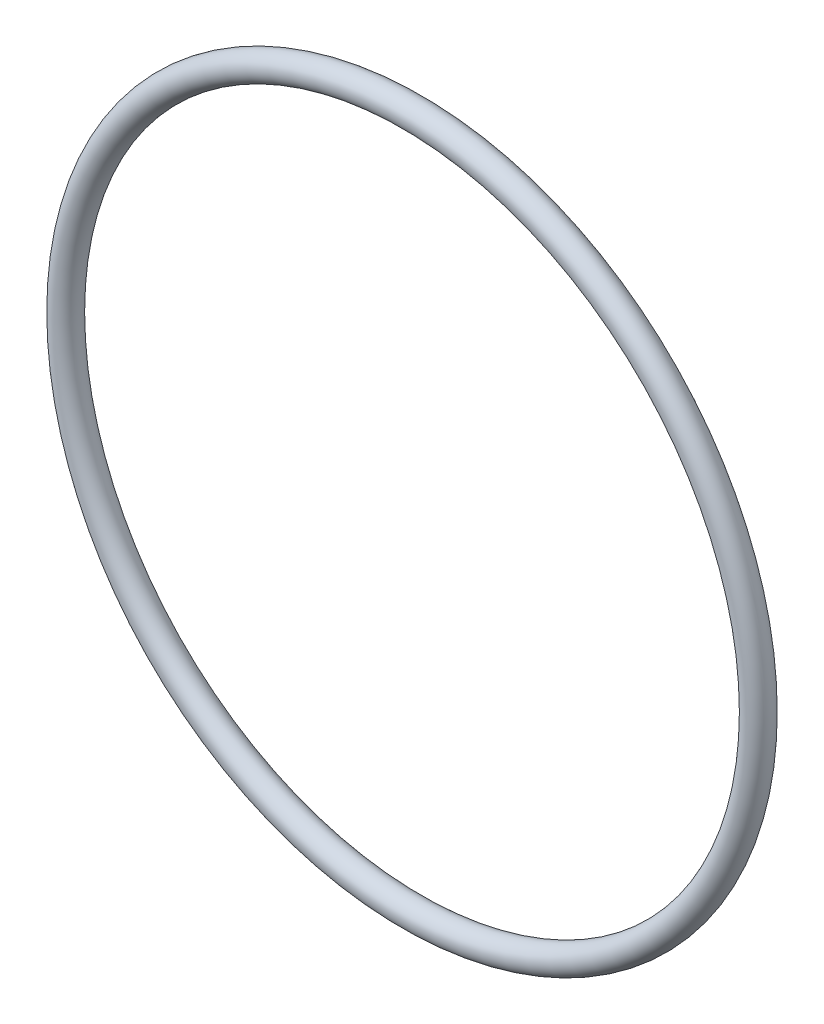
ISO-10303-21;
HEADER;
FILE_DESCRIPTION(('STEP AP214'),'2;1');
FILE_NAME('part.step','',(''),(''),'','','');
FILE_SCHEMA(('AUTOMOTIVE_DESIGN { 1 0 10303 214 1 1 1 1 }'));
ENDSEC;
DATA;
#1=APPLICATION_CONTEXT('core data for automotive mechanical design processes');
#2=APPLICATION_PROTOCOL_DEFINITION('international standard','automotive_design',2000,#1);
#3=PRODUCT_CONTEXT('',#1,'mechanical');
#4=PRODUCT('Part','Part','',(#3));
#5=PRODUCT_RELATED_PRODUCT_CATEGORY('part','',(#4));
#6=PRODUCT_DEFINITION_FORMATION('','',#4);
#7=PRODUCT_DEFINITION_CONTEXT('part definition',#1,'design');
#8=PRODUCT_DEFINITION('design','',#6,#7);
#9=PRODUCT_DEFINITION_SHAPE('','',#8);
#10=(LENGTH_UNIT() NAMED_UNIT(*) SI_UNIT(.MILLI.,.METRE.));
#11=(NAMED_UNIT(*) PLANE_ANGLE_UNIT() SI_UNIT($,.RADIAN.));
#12=(NAMED_UNIT(*) SI_UNIT($,.STERADIAN.) SOLID_ANGLE_UNIT());
#13=UNCERTAINTY_MEASURE_WITH_UNIT(LENGTH_MEASURE(1.E-05),#10,'distance_accuracy_value','');
#14=(GEOMETRIC_REPRESENTATION_CONTEXT(3) GLOBAL_UNCERTAINTY_ASSIGNED_CONTEXT((#13)) GLOBAL_UNIT_ASSIGNED_CONTEXT((#10,
#11,#12)) REPRESENTATION_CONTEXT('',''));
#15=CARTESIAN_POINT('',(0.,0.,0.));
#16=DIRECTION('',(0.,0.,1.));
#17=DIRECTION('',(1.,0.,0.));
#18=AXIS2_PLACEMENT_3D('',#15,#16,#17);
#19=CARTESIAN_POINT('',(0.,0.,0.));
#20=DIRECTION('',(0.,0.,1.));
#21=DIRECTION('',(1.,0.,0.));
#22=AXIS2_PLACEMENT_3D('',#19,#20,#21);
#23=TOROIDAL_SURFACE('',#22,22.9743,0.888999999999996);
#24=CARTESIAN_POINT('',(23.8633,0.,0.));
#25=VERTEX_POINT('',#24);
#26=VERTEX_LOOP('',#25);
#27=FACE_BOUND('',#26,.T.);
#28=ADVANCED_FACE('F32',(#27),#23,.T.);
#29=CLOSED_SHELL('',(#28));
#30=MANIFOLD_SOLID_BREP('B2',#29);
#31=ADVANCED_BREP_SHAPE_REPRESENTATION('',(#18,#30),#14);
#32=SHAPE_DEFINITION_REPRESENTATION(#9,#31);
ENDSEC;
END-ISO-10303-21;
